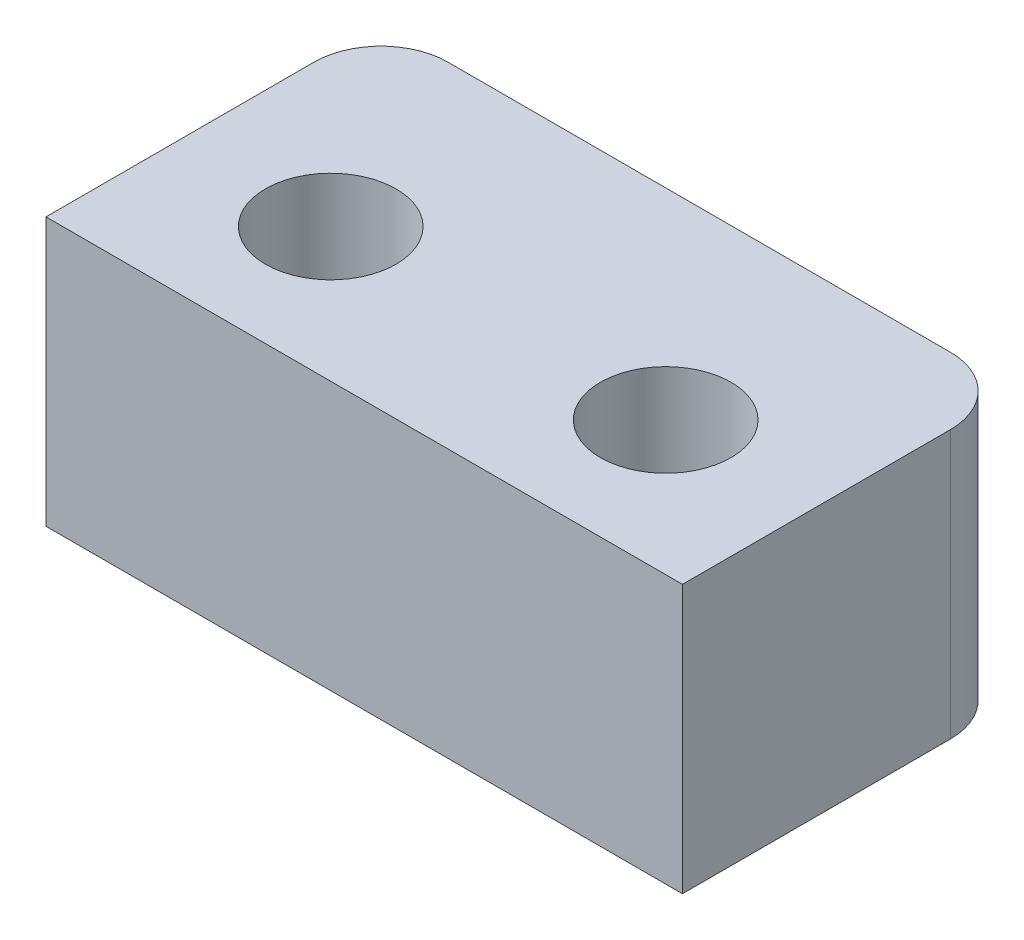
ISO-10303-21;
HEADER;
FILE_DESCRIPTION(('STEP AP214'),'2;1');
FILE_NAME('part.step','',(''),(''),'','','');
FILE_SCHEMA(('AUTOMOTIVE_DESIGN { 1 0 10303 214 1 1 1 1 }'));
ENDSEC;
DATA;
#1=APPLICATION_CONTEXT('core data for automotive mechanical design processes');
#2=APPLICATION_PROTOCOL_DEFINITION('international standard','automotive_design',2000,#1);
#3=PRODUCT_CONTEXT('',#1,'mechanical');
#4=PRODUCT('Part','Part','',(#3));
#5=PRODUCT_RELATED_PRODUCT_CATEGORY('part','',(#4));
#6=PRODUCT_DEFINITION_FORMATION('','',#4);
#7=PRODUCT_DEFINITION_CONTEXT('part definition',#1,'design');
#8=PRODUCT_DEFINITION('design','',#6,#7);
#9=PRODUCT_DEFINITION_SHAPE('','',#8);
#10=(LENGTH_UNIT() NAMED_UNIT(*) SI_UNIT(.MILLI.,.METRE.));
#11=(NAMED_UNIT(*) PLANE_ANGLE_UNIT() SI_UNIT($,.RADIAN.));
#12=(NAMED_UNIT(*) SI_UNIT($,.STERADIAN.) SOLID_ANGLE_UNIT());
#13=UNCERTAINTY_MEASURE_WITH_UNIT(LENGTH_MEASURE(1.E-05),#10,'distance_accuracy_value','');
#14=(GEOMETRIC_REPRESENTATION_CONTEXT(3) GLOBAL_UNCERTAINTY_ASSIGNED_CONTEXT((#13)) GLOBAL_UNIT_ASSIGNED_CONTEXT((#10,
#11,#12)) REPRESENTATION_CONTEXT('',''));
#15=CARTESIAN_POINT('',(0.,0.,0.));
#16=DIRECTION('',(0.,0.,1.));
#17=DIRECTION('',(1.,0.,0.));
#18=AXIS2_PLACEMENT_3D('',#15,#16,#17);
#19=CARTESIAN_POINT('',(15.,8.,7.5));
#20=DIRECTION('',(0.,0.,-1.));
#21=DIRECTION('',(-1.,0.,0.));
#22=AXIS2_PLACEMENT_3D('',#19,#20,#21);
#23=PLANE('',#22);
#24=DIRECTION('',(0.,1.,0.));
#25=VECTOR('',#24,1.);
#26=CARTESIAN_POINT('',(-9.5,-2.,7.50000000000001));
#27=LINE('',#26,#25);
#28=CARTESIAN_POINT('',(-9.5,0.,7.50000000000001));
#29=VERTEX_POINT('',#28);
#30=CARTESIAN_POINT('',(-9.5,8.,7.50000000000001));
#31=VERTEX_POINT('',#30);
#32=EDGE_CURVE('E110',#29,#31,#27,.T.);
#33=ORIENTED_EDGE('',*,*,#32,.F.);
#34=DIRECTION('',(1.,0.,0.));
#35=VECTOR('',#34,1.);
#36=CARTESIAN_POINT('',(15.,0.,7.5));
#37=LINE('',#36,#35);
#38=CARTESIAN_POINT('',(9.5,0.,7.5));
#39=VERTEX_POINT('',#38);
#40=EDGE_CURVE('E108',#29,#39,#37,.T.);
#41=ORIENTED_EDGE('',*,*,#40,.T.);
#42=DIRECTION('',(0.,1.,0.));
#43=VECTOR('',#42,1.);
#44=CARTESIAN_POINT('',(9.5,-2.,7.5));
#45=LINE('',#44,#43);
#46=CARTESIAN_POINT('',(9.5,8.,7.5));
#47=VERTEX_POINT('',#46);
#48=EDGE_CURVE('E93',#39,#47,#45,.T.);
#49=ORIENTED_EDGE('',*,*,#48,.T.);
#50=DIRECTION('',(1.,0.,0.));
#51=VECTOR('',#50,1.);
#52=CARTESIAN_POINT('',(15.,8.,7.5));
#53=LINE('',#52,#51);
#54=EDGE_CURVE('E106',#31,#47,#53,.T.);
#55=ORIENTED_EDGE('',*,*,#54,.F.);
#56=EDGE_LOOP('',(#33,#41,#49,#55));
#57=FACE_BOUND('',#56,.T.);
#58=ADVANCED_FACE('F36',(#57),#23,.F.);
#59=CARTESIAN_POINT('',(0.,8.,0.));
#60=DIRECTION('',(0.,1.,0.));
#61=DIRECTION('',(0.,0.,1.));
#62=AXIS2_PLACEMENT_3D('',#59,#60,#61);
#63=PLANE('',#62);
#64=CARTESIAN_POINT('',(-5.,8.,3.5));
#65=DIRECTION('',(0.,1.,0.));
#66=DIRECTION('',(0.,0.,1.));
#67=AXIS2_PLACEMENT_3D('',#64,#65,#66);
#68=CIRCLE('',#67,1.95);
#69=CARTESIAN_POINT('',(-5.,8.,5.45));
#70=VERTEX_POINT('',#69);
#71=EDGE_CURVE('E152',#70,#70,#68,.T.);
#72=ORIENTED_EDGE('',*,*,#71,.F.);
#73=EDGE_LOOP('',(#72));
#74=FACE_BOUND('',#73,.T.);
#75=CARTESIAN_POINT('',(5.,8.,3.5));
#76=DIRECTION('',(0.,1.,0.));
#77=DIRECTION('',(0.,0.,1.));
#78=AXIS2_PLACEMENT_3D('',#75,#76,#77);
#79=CIRCLE('',#78,1.95);
#80=CARTESIAN_POINT('',(5.,8.,5.45));
#81=VERTEX_POINT('',#80);
#82=EDGE_CURVE('E109',#81,#81,#79,.T.);
#83=ORIENTED_EDGE('',*,*,#82,.F.);
#84=EDGE_LOOP('',(#83));
#85=FACE_BOUND('',#84,.T.);
#86=DIRECTION('',(0.,0.,-1.));
#87=VECTOR('',#86,1.);
#88=CARTESIAN_POINT('',(9.5,8.,7.5));
#89=LINE('',#88,#87);
#90=CARTESIAN_POINT('',(9.5,8.,-0.499999999999997));
#91=VERTEX_POINT('',#90);
#92=EDGE_CURVE('E89',#47,#91,#89,.T.);
#93=ORIENTED_EDGE('',*,*,#92,.T.);
#94=CARTESIAN_POINT('',(7.5,8.,-0.499999999999997));
#95=DIRECTION('',(0.,1.,0.));
#96=DIRECTION('',(0.,0.,1.));
#97=AXIS2_PLACEMENT_3D('',#94,#95,#96);
#98=CIRCLE('',#97,2.);
#99=CARTESIAN_POINT('',(7.5,8.,-2.5));
#100=VERTEX_POINT('',#99);
#101=EDGE_CURVE('E129',#91,#100,#98,.T.);
#102=ORIENTED_EDGE('',*,*,#101,.T.);
#103=DIRECTION('',(-1.,0.,0.));
#104=VECTOR('',#103,1.);
#105=CARTESIAN_POINT('',(9.5,8.,-2.5));
#106=LINE('',#105,#104);
#107=CARTESIAN_POINT('',(-7.5,8.,-2.5));
#108=VERTEX_POINT('',#107);
#109=EDGE_CURVE('E99',#100,#108,#106,.T.);
#110=ORIENTED_EDGE('',*,*,#109,.T.);
#111=CARTESIAN_POINT('',(-7.5,8.,-0.499999999999995));
#112=DIRECTION('',(0.,1.,0.));
#113=DIRECTION('',(0.,0.,1.));
#114=AXIS2_PLACEMENT_3D('',#111,#112,#113);
#115=CIRCLE('',#114,2.);
#116=CARTESIAN_POINT('',(-9.5,8.,-0.499999999999994));
#117=VERTEX_POINT('',#116);
#118=EDGE_CURVE('E127',#108,#117,#115,.T.);
#119=ORIENTED_EDGE('',*,*,#118,.T.);
#120=DIRECTION('',(0.,0.,1.));
#121=VECTOR('',#120,1.);
#122=CARTESIAN_POINT('',(-9.5,8.,7.50000000000001));
#123=LINE('',#122,#121);
#124=EDGE_CURVE('E100',#117,#31,#123,.T.);
#125=ORIENTED_EDGE('',*,*,#124,.T.);
#126=ORIENTED_EDGE('',*,*,#54,.T.);
#127=EDGE_LOOP('',(#93,#102,#110,#119,#125,#126));
#128=FACE_BOUND('',#127,.T.);
#129=ADVANCED_FACE('F112',(#74,#85,#128),#63,.T.);
#130=CARTESIAN_POINT('',(0.,0.,0.));
#131=DIRECTION('',(0.,1.,0.));
#132=DIRECTION('',(0.,0.,1.));
#133=AXIS2_PLACEMENT_3D('',#130,#131,#132);
#134=PLANE('',#133);
#135=CARTESIAN_POINT('',(5.,0.,3.5));
#136=DIRECTION('',(0.,1.,0.));
#137=DIRECTION('',(0.,0.,1.));
#138=AXIS2_PLACEMENT_3D('',#135,#136,#137);
#139=CIRCLE('',#138,1.95);
#140=CARTESIAN_POINT('',(5.,0.,5.45));
#141=VERTEX_POINT('',#140);
#142=EDGE_CURVE('E154',#141,#141,#139,.T.);
#143=ORIENTED_EDGE('',*,*,#142,.T.);
#144=EDGE_LOOP('',(#143));
#145=FACE_BOUND('',#144,.T.);
#146=CARTESIAN_POINT('',(-5.,0.,3.5));
#147=DIRECTION('',(0.,1.,0.));
#148=DIRECTION('',(0.,0.,1.));
#149=AXIS2_PLACEMENT_3D('',#146,#147,#148);
#150=CIRCLE('',#149,1.95);
#151=CARTESIAN_POINT('',(-5.,0.,5.45));
#152=VERTEX_POINT('',#151);
#153=EDGE_CURVE('E118',#152,#152,#150,.T.);
#154=ORIENTED_EDGE('',*,*,#153,.T.);
#155=EDGE_LOOP('',(#154));
#156=FACE_BOUND('',#155,.T.);
#157=DIRECTION('',(-1.,0.,0.));
#158=VECTOR('',#157,1.);
#159=CARTESIAN_POINT('',(0.,0.,-2.5));
#160=LINE('',#159,#158);
#161=CARTESIAN_POINT('',(7.5,0.,-2.5));
#162=VERTEX_POINT('',#161);
#163=CARTESIAN_POINT('',(-7.5,0.,-2.49999999999999));
#164=VERTEX_POINT('',#163);
#165=EDGE_CURVE('E116',#162,#164,#160,.T.);
#166=ORIENTED_EDGE('',*,*,#165,.F.);
#167=CARTESIAN_POINT('',(7.5,0.,-0.499999999999997));
#168=DIRECTION('',(0.,1.,0.));
#169=DIRECTION('',(0.,0.,1.));
#170=AXIS2_PLACEMENT_3D('',#167,#168,#169);
#171=CIRCLE('',#170,2.);
#172=CARTESIAN_POINT('',(9.5,0.,-0.499999999999997));
#173=VERTEX_POINT('',#172);
#174=EDGE_CURVE('E44',#162,#173,#171,.F.);
#175=ORIENTED_EDGE('',*,*,#174,.T.);
#176=DIRECTION('',(0.,0.,-1.));
#177=VECTOR('',#176,1.);
#178=CARTESIAN_POINT('',(9.5,0.,0.));
#179=LINE('',#178,#177);
#180=EDGE_CURVE('E114',#39,#173,#179,.T.);
#181=ORIENTED_EDGE('',*,*,#180,.F.);
#182=ORIENTED_EDGE('',*,*,#40,.F.);
#183=DIRECTION('',(0.,0.,1.));
#184=VECTOR('',#183,1.);
#185=CARTESIAN_POINT('',(-9.5,0.,0.));
#186=LINE('',#185,#184);
#187=CARTESIAN_POINT('',(-9.5,0.,-0.499999999999995));
#188=VERTEX_POINT('',#187);
#189=EDGE_CURVE('E124',#188,#29,#186,.T.);
#190=ORIENTED_EDGE('',*,*,#189,.F.);
#191=CARTESIAN_POINT('',(-7.5,0.,-0.499999999999995));
#192=DIRECTION('',(0.,1.,0.));
#193=DIRECTION('',(0.,0.,1.));
#194=AXIS2_PLACEMENT_3D('',#191,#192,#193);
#195=CIRCLE('',#194,2.);
#196=EDGE_CURVE('E56',#188,#164,#195,.F.);
#197=ORIENTED_EDGE('',*,*,#196,.T.);
#198=EDGE_LOOP('',(#166,#175,#181,#182,#190,#197));
#199=FACE_BOUND('',#198,.T.);
#200=ADVANCED_FACE('F137',(#145,#156,#199),#134,.F.);
#201=CARTESIAN_POINT('',(5.,0.,3.5));
#202=DIRECTION('',(0.,1.,0.));
#203=DIRECTION('',(0.,0.,1.));
#204=AXIS2_PLACEMENT_3D('',#201,#202,#203);
#205=CYLINDRICAL_SURFACE('',#204,1.95);
#206=ORIENTED_EDGE('',*,*,#142,.F.);
#207=EDGE_LOOP('',(#206));
#208=FACE_BOUND('',#207,.T.);
#209=ORIENTED_EDGE('',*,*,#82,.T.);
#210=EDGE_LOOP('',(#209));
#211=FACE_BOUND('',#210,.T.);
#212=ADVANCED_FACE('F161',(#208,#211),#205,.F.);
#213=CARTESIAN_POINT('',(-5.,0.,3.5));
#214=DIRECTION('',(0.,1.,0.));
#215=DIRECTION('',(0.,0.,1.));
#216=AXIS2_PLACEMENT_3D('',#213,#214,#215);
#217=CYLINDRICAL_SURFACE('',#216,1.95);
#218=ORIENTED_EDGE('',*,*,#153,.F.);
#219=EDGE_LOOP('',(#218));
#220=FACE_BOUND('',#219,.T.);
#221=ORIENTED_EDGE('',*,*,#71,.T.);
#222=EDGE_LOOP('',(#221));
#223=FACE_BOUND('',#222,.T.);
#224=ADVANCED_FACE('F189',(#220,#223),#217,.F.);
#225=CARTESIAN_POINT('',(-9.5,-2.,7.50000000000001));
#226=DIRECTION('',(-1.,0.,0.));
#227=DIRECTION('',(0.,0.,1.));
#228=AXIS2_PLACEMENT_3D('',#225,#226,#227);
#229=PLANE('',#228);
#230=ORIENTED_EDGE('',*,*,#124,.F.);
#231=DIRECTION('',(0.,1.,0.));
#232=VECTOR('',#231,1.);
#233=CARTESIAN_POINT('',(-9.5,-2.,-0.499999999999994));
#234=LINE('',#233,#232);
#235=EDGE_CURVE('E12',#117,#188,#234,.F.);
#236=ORIENTED_EDGE('',*,*,#235,.T.);
#237=ORIENTED_EDGE('',*,*,#189,.T.);
#238=ORIENTED_EDGE('',*,*,#32,.T.);
#239=EDGE_LOOP('',(#230,#236,#237,#238));
#240=FACE_BOUND('',#239,.T.);
#241=ADVANCED_FACE('F185',(#240),#229,.T.);
#242=CARTESIAN_POINT('',(9.5,-2.,-2.5));
#243=DIRECTION('',(0.,0.,-1.));
#244=DIRECTION('',(-1.,0.,0.));
#245=AXIS2_PLACEMENT_3D('',#242,#243,#244);
#246=PLANE('',#245);
#247=ORIENTED_EDGE('',*,*,#109,.F.);
#248=DIRECTION('',(0.,1.,0.));
#249=VECTOR('',#248,1.);
#250=CARTESIAN_POINT('',(7.5,-2.,-2.5));
#251=LINE('',#250,#249);
#252=EDGE_CURVE('E134',#100,#162,#251,.F.);
#253=ORIENTED_EDGE('',*,*,#252,.T.);
#254=ORIENTED_EDGE('',*,*,#165,.T.);
#255=DIRECTION('',(0.,1.,0.));
#256=VECTOR('',#255,1.);
#257=CARTESIAN_POINT('',(-7.5,-2.,-2.5));
#258=LINE('',#257,#256);
#259=EDGE_CURVE('E131',#164,#108,#258,.T.);
#260=ORIENTED_EDGE('',*,*,#259,.T.);
#261=EDGE_LOOP('',(#247,#253,#254,#260));
#262=FACE_BOUND('',#261,.T.);
#263=ADVANCED_FACE('F144',(#262),#246,.T.);
#264=CARTESIAN_POINT('',(9.5,-2.,7.5));
#265=DIRECTION('',(1.,0.,0.));
#266=DIRECTION('',(0.,0.,-1.));
#267=AXIS2_PLACEMENT_3D('',#264,#265,#266);
#268=PLANE('',#267);
#269=ORIENTED_EDGE('',*,*,#180,.T.);
#270=DIRECTION('',(0.,1.,0.));
#271=VECTOR('',#270,1.);
#272=CARTESIAN_POINT('',(9.5,-2.,-0.499999999999997));
#273=LINE('',#272,#271);
#274=EDGE_CURVE('E96',#173,#91,#273,.T.);
#275=ORIENTED_EDGE('',*,*,#274,.T.);
#276=ORIENTED_EDGE('',*,*,#92,.F.);
#277=ORIENTED_EDGE('',*,*,#48,.F.);
#278=EDGE_LOOP('',(#269,#275,#276,#277));
#279=FACE_BOUND('',#278,.T.);
#280=ADVANCED_FACE('F92',(#279),#268,.T.);
#281=CARTESIAN_POINT('',(7.5,-2.,-0.499999999999997));
#282=DIRECTION('',(0.,1.,0.));
#283=DIRECTION('',(0.,0.,1.));
#284=AXIS2_PLACEMENT_3D('',#281,#282,#283);
#285=CYLINDRICAL_SURFACE('',#284,2.);
#286=ORIENTED_EDGE('',*,*,#174,.F.);
#287=ORIENTED_EDGE('',*,*,#252,.F.);
#288=ORIENTED_EDGE('',*,*,#101,.F.);
#289=ORIENTED_EDGE('',*,*,#274,.F.);
#290=EDGE_LOOP('',(#286,#287,#288,#289));
#291=FACE_BOUND('',#290,.T.);
#292=ADVANCED_FACE('F140',(#291),#285,.T.);
#293=CARTESIAN_POINT('',(-7.5,-2.,-0.499999999999995));
#294=DIRECTION('',(0.,1.,0.));
#295=DIRECTION('',(0.,0.,1.));
#296=AXIS2_PLACEMENT_3D('',#293,#294,#295);
#297=CYLINDRICAL_SURFACE('',#296,2.);
#298=ORIENTED_EDGE('',*,*,#196,.F.);
#299=ORIENTED_EDGE('',*,*,#235,.F.);
#300=ORIENTED_EDGE('',*,*,#118,.F.);
#301=ORIENTED_EDGE('',*,*,#259,.F.);
#302=EDGE_LOOP('',(#298,#299,#300,#301));
#303=FACE_BOUND('',#302,.T.);
#304=ADVANCED_FACE('F38',(#303),#297,.T.);
#305=CLOSED_SHELL('',(#58,#129,#200,#212,#224,#241,#263,#280,#292,#304));
#306=MANIFOLD_SOLID_BREP('B2',#305);
#307=ADVANCED_BREP_SHAPE_REPRESENTATION('',(#18,#306),#14);
#308=SHAPE_DEFINITION_REPRESENTATION(#9,#307);
ENDSEC;
END-ISO-10303-21;
